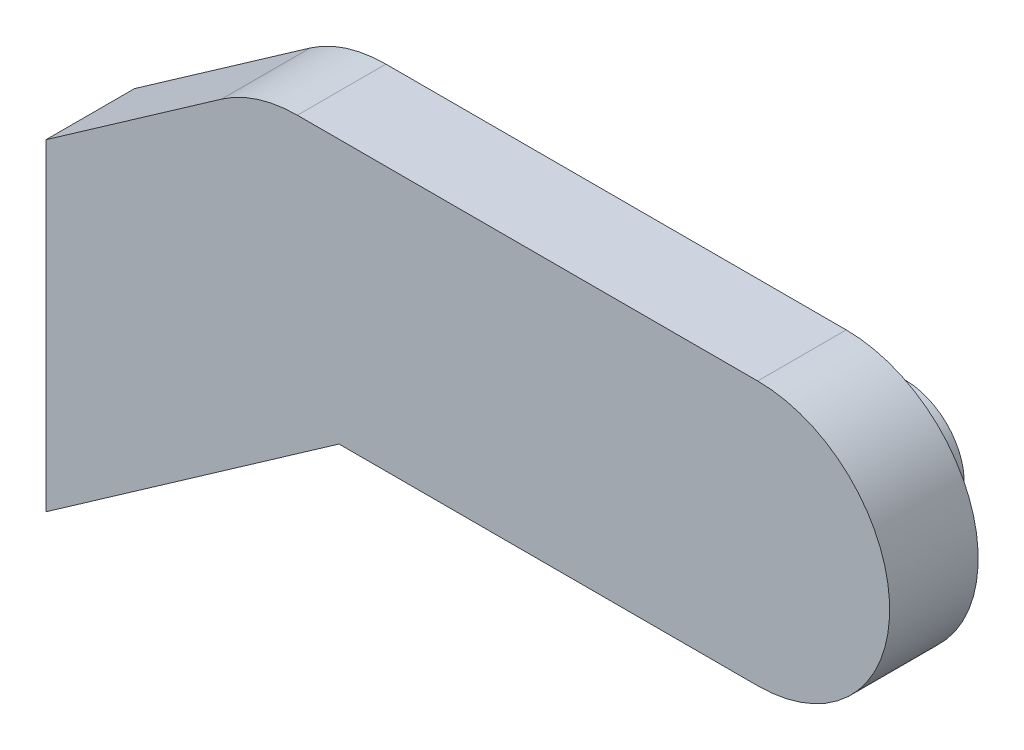
ISO-10303-21;
HEADER;
FILE_DESCRIPTION(('STEP AP214'),'2;1');
FILE_NAME('part.step','',(''),(''),'','','');
FILE_SCHEMA(('AUTOMOTIVE_DESIGN { 1 0 10303 214 1 1 1 1 }'));
ENDSEC;
DATA;
#1=APPLICATION_CONTEXT('core data for automotive mechanical design processes');
#2=APPLICATION_PROTOCOL_DEFINITION('international standard','automotive_design',2000,#1);
#3=PRODUCT_CONTEXT('',#1,'mechanical');
#4=PRODUCT('Part','Part','',(#3));
#5=PRODUCT_RELATED_PRODUCT_CATEGORY('part','',(#4));
#6=PRODUCT_DEFINITION_FORMATION('','',#4);
#7=PRODUCT_DEFINITION_CONTEXT('part definition',#1,'design');
#8=PRODUCT_DEFINITION('design','',#6,#7);
#9=PRODUCT_DEFINITION_SHAPE('','',#8);
#10=(LENGTH_UNIT() NAMED_UNIT(*) SI_UNIT(.MILLI.,.METRE.));
#11=(NAMED_UNIT(*) PLANE_ANGLE_UNIT() SI_UNIT($,.RADIAN.));
#12=(NAMED_UNIT(*) SI_UNIT($,.STERADIAN.) SOLID_ANGLE_UNIT());
#13=UNCERTAINTY_MEASURE_WITH_UNIT(LENGTH_MEASURE(1.E-05),#10,'distance_accuracy_value','');
#14=(GEOMETRIC_REPRESENTATION_CONTEXT(3) GLOBAL_UNCERTAINTY_ASSIGNED_CONTEXT((#13)) GLOBAL_UNIT_ASSIGNED_CONTEXT((#10,
#11,#12)) REPRESENTATION_CONTEXT('',''));
#15=CARTESIAN_POINT('',(0.,0.,0.));
#16=DIRECTION('',(0.,0.,1.));
#17=DIRECTION('',(1.,0.,0.));
#18=AXIS2_PLACEMENT_3D('',#15,#16,#17);
#19=CARTESIAN_POINT('',(0.,44.73,15.));
#20=DIRECTION('',(0.,-1.,0.));
#21=DIRECTION('',(0.,0.,-1.));
#22=AXIS2_PLACEMENT_3D('',#19,#20,#21);
#23=PLANE('',#22);
#24=DIRECTION('',(-1.,0.,0.));
#25=VECTOR('',#24,1.);
#26=CARTESIAN_POINT('',(0.,44.73,0.));
#27=LINE('',#26,#25);
#28=CARTESIAN_POINT('',(153.21162338788,44.73,0.));
#29=VERTEX_POINT('',#28);
#30=CARTESIAN_POINT('',(75.2116233878799,44.73,0.));
#31=VERTEX_POINT('',#30);
#32=EDGE_CURVE('E51',#29,#31,#27,.T.);
#33=ORIENTED_EDGE('',*,*,#32,.T.);
#34=DIRECTION('',(0.,0.,-1.));
#35=VECTOR('',#34,1.);
#36=CARTESIAN_POINT('',(75.2116233878799,44.73,102.507492208612));
#37=LINE('',#36,#35);
#38=CARTESIAN_POINT('',(75.2116233878799,44.73,15.));
#39=VERTEX_POINT('',#38);
#40=EDGE_CURVE('E109',#39,#31,#37,.T.);
#41=ORIENTED_EDGE('',*,*,#40,.F.);
#42=DIRECTION('',(-1.,0.,0.));
#43=VECTOR('',#42,1.);
#44=CARTESIAN_POINT('',(0.,44.73,15.));
#45=LINE('',#44,#43);
#46=CARTESIAN_POINT('',(153.21162338788,44.73,15.));
#47=VERTEX_POINT('',#46);
#48=EDGE_CURVE('E11',#47,#39,#45,.T.);
#49=ORIENTED_EDGE('',*,*,#48,.F.);
#50=DIRECTION('',(0.,0.,1.));
#51=VECTOR('',#50,1.);
#52=CARTESIAN_POINT('',(153.21162338788,44.73,-0.000999999999999265));
#53=LINE('',#52,#51);
#54=EDGE_CURVE('E131',#29,#47,#53,.T.);
#55=ORIENTED_EDGE('',*,*,#54,.F.);
#56=EDGE_LOOP('',(#33,#41,#49,#55));
#57=FACE_BOUND('',#56,.T.);
#58=ADVANCED_FACE('F50',(#57),#23,.F.);
#59=CARTESIAN_POINT('',(0.,0.,15.));
#60=DIRECTION('',(0.,0.,-1.));
#61=DIRECTION('',(-1.,0.,0.));
#62=AXIS2_PLACEMENT_3D('',#59,#60,#61);
#63=PLANE('',#62);
#64=DIRECTION('',(0.819152044288991,0.573576436351047,0.));
#65=VECTOR('',#64,1.);
#66=CARTESIAN_POINT('',(62.3835863888887,40.6853354705233,15.));
#67=LINE('',#66,#65);
#68=CARTESIAN_POINT('',(32.6157170848523,19.8416489873955,15.));
#69=VERTEX_POINT('',#68);
#70=CARTESIAN_POINT('',(62.3835863888887,40.6853354705233,15.));
#71=VERTEX_POINT('',#70);
#72=EDGE_CURVE('E184',#69,#71,#67,.T.);
#73=ORIENTED_EDGE('',*,*,#72,.F.);
#74=DIRECTION('',(0.,1.,0.));
#75=VECTOR('',#74,1.);
#76=CARTESIAN_POINT('',(32.6157170848524,0.,15.));
#77=LINE('',#76,#75);
#78=CARTESIAN_POINT('',(32.6157170848524,-34.7635983679045,15.));
#79=VERTEX_POINT('',#78);
#80=EDGE_CURVE('E174',#79,#69,#77,.T.);
#81=ORIENTED_EDGE('',*,*,#80,.F.);
#82=DIRECTION('',(0.819152044288991,0.573576436351047,0.));
#83=VECTOR('',#82,1.);
#84=CARTESIAN_POINT('',(27.0637908555533,-38.6510989652439,15.));
#85=LINE('',#84,#83);
#86=CARTESIAN_POINT('',(82.2632808011584,0.,15.));
#87=VERTEX_POINT('',#86);
#88=EDGE_CURVE('E153',#79,#87,#85,.T.);
#89=ORIENTED_EDGE('',*,*,#88,.T.);
#90=DIRECTION('',(1.,0.,0.));
#91=VECTOR('',#90,1.);
#92=CARTESIAN_POINT('',(0.,0.,15.));
#93=LINE('',#92,#91);
#94=CARTESIAN_POINT('',(153.21162338788,0.,15.));
#95=VERTEX_POINT('',#94);
#96=EDGE_CURVE('E57',#87,#95,#93,.T.);
#97=ORIENTED_EDGE('',*,*,#96,.T.);
#98=CARTESIAN_POINT('',(153.21162338788,22.365,15.));
#99=DIRECTION('',(0.,0.,1.));
#100=DIRECTION('',(1.,0.,0.));
#101=AXIS2_PLACEMENT_3D('',#98,#99,#100);
#102=CIRCLE('',#101,22.365);
#103=EDGE_CURVE('E136',#95,#47,#102,.T.);
#104=ORIENTED_EDGE('',*,*,#103,.T.);
#105=ORIENTED_EDGE('',*,*,#48,.T.);
#106=CARTESIAN_POINT('',(75.2116233878799,22.365,15.));
#107=DIRECTION('',(0.,0.,-1.));
#108=DIRECTION('',(-1.,0.,0.));
#109=AXIS2_PLACEMENT_3D('',#106,#107,#108);
#110=CIRCLE('',#109,22.365);
#111=EDGE_CURVE('E120',#71,#39,#110,.T.);
#112=ORIENTED_EDGE('',*,*,#111,.F.);
#113=EDGE_LOOP('',(#73,#81,#89,#97,#104,#105,#112));
#114=FACE_BOUND('',#113,.T.);
#115=ADVANCED_FACE('F200',(#114),#63,.F.);
#116=CARTESIAN_POINT('',(0.,0.,0.));
#117=DIRECTION('',(0.,0.,-1.));
#118=DIRECTION('',(-1.,0.,0.));
#119=AXIS2_PLACEMENT_3D('',#116,#117,#118);
#120=PLANE('',#119);
#121=DIRECTION('',(0.,-1.,0.));
#122=VECTOR('',#121,1.);
#123=CARTESIAN_POINT('',(32.6157170848524,0.,0.));
#124=LINE('',#123,#122);
#125=CARTESIAN_POINT('',(32.6157170848524,19.8416489873955,0.));
#126=VERTEX_POINT('',#125);
#127=CARTESIAN_POINT('',(32.6157170848524,-34.7635983679045,0.));
#128=VERTEX_POINT('',#127);
#129=EDGE_CURVE('E182',#126,#128,#124,.T.);
#130=ORIENTED_EDGE('',*,*,#129,.F.);
#131=DIRECTION('',(-0.819152044288991,-0.573576436351047,0.));
#132=VECTOR('',#131,1.);
#133=CARTESIAN_POINT('',(62.3835863888887,40.6853354705233,0.));
#134=LINE('',#133,#132);
#135=CARTESIAN_POINT('',(62.3835863888887,40.6853354705233,0.));
#136=VERTEX_POINT('',#135);
#137=EDGE_CURVE('E125',#136,#126,#134,.T.);
#138=ORIENTED_EDGE('',*,*,#137,.F.);
#139=CARTESIAN_POINT('',(75.2116233878799,22.365,0.));
#140=DIRECTION('',(0.,0.,1.));
#141=DIRECTION('',(-1.,0.,0.));
#142=AXIS2_PLACEMENT_3D('',#139,#140,#141);
#143=CIRCLE('',#142,22.365);
#144=EDGE_CURVE('E112',#31,#136,#143,.T.);
#145=ORIENTED_EDGE('',*,*,#144,.F.);
#146=ORIENTED_EDGE('',*,*,#32,.F.);
#147=CARTESIAN_POINT('',(153.21162338788,22.365,0.));
#148=DIRECTION('',(0.,0.,-1.));
#149=DIRECTION('',(-1.,0.,0.));
#150=AXIS2_PLACEMENT_3D('',#147,#148,#149);
#151=CIRCLE('',#150,22.365);
#152=CARTESIAN_POINT('',(153.21162338788,0.,0.));
#153=VERTEX_POINT('',#152);
#154=EDGE_CURVE('E142',#153,#29,#151,.F.);
#155=ORIENTED_EDGE('',*,*,#154,.F.);
#156=DIRECTION('',(1.,0.,0.));
#157=VECTOR('',#156,1.);
#158=CARTESIAN_POINT('',(0.,0.,0.));
#159=LINE('',#158,#157);
#160=CARTESIAN_POINT('',(82.2632808011584,0.,0.));
#161=VERTEX_POINT('',#160);
#162=EDGE_CURVE('E74',#161,#153,#159,.T.);
#163=ORIENTED_EDGE('',*,*,#162,.F.);
#164=DIRECTION('',(-0.819152044288991,-0.573576436351047,0.));
#165=VECTOR('',#164,1.);
#166=CARTESIAN_POINT('',(27.0637908555533,-38.6510989652439,0.));
#167=LINE('',#166,#165);
#168=EDGE_CURVE('E179',#161,#128,#167,.T.);
#169=ORIENTED_EDGE('',*,*,#168,.T.);
#170=EDGE_LOOP('',(#130,#138,#145,#146,#155,#163,#169));
#171=FACE_BOUND('',#170,.T.);
#172=CARTESIAN_POINT('',(153.21162338788,22.365,0.));
#173=DIRECTION('',(0.,0.,-1.));
#174=DIRECTION('',(-1.,0.,0.));
#175=AXIS2_PLACEMENT_3D('',#172,#173,#174);
#176=CIRCLE('',#175,10.);
#177=CARTESIAN_POINT('',(143.21162338788,22.365,0.));
#178=VERTEX_POINT('',#177);
#179=EDGE_CURVE('E144',#178,#178,#176,.T.);
#180=ORIENTED_EDGE('',*,*,#179,.F.);
#181=EDGE_LOOP('',(#180));
#182=FACE_BOUND('',#181,.T.);
#183=ADVANCED_FACE('F126',(#171,#182),#120,.T.);
#184=CARTESIAN_POINT('',(0.,0.,15.));
#185=DIRECTION('',(0.,1.,0.));
#186=DIRECTION('',(0.,0.,1.));
#187=AXIS2_PLACEMENT_3D('',#184,#185,#186);
#188=PLANE('',#187);
#189=ORIENTED_EDGE('',*,*,#96,.F.);
#190=DIRECTION('',(0.,0.,-1.));
#191=VECTOR('',#190,1.);
#192=CARTESIAN_POINT('',(82.2632808011584,0.,178.575832299459));
#193=LINE('',#192,#191);
#194=EDGE_CURVE('E63',#87,#161,#193,.T.);
#195=ORIENTED_EDGE('',*,*,#194,.T.);
#196=ORIENTED_EDGE('',*,*,#162,.T.);
#197=DIRECTION('',(0.,0.,1.));
#198=VECTOR('',#197,1.);
#199=CARTESIAN_POINT('',(153.21162338788,0.,-0.000999999999999265));
#200=LINE('',#199,#198);
#201=EDGE_CURVE('E133',#153,#95,#200,.T.);
#202=ORIENTED_EDGE('',*,*,#201,.T.);
#203=EDGE_LOOP('',(#189,#195,#196,#202));
#204=FACE_BOUND('',#203,.T.);
#205=ADVANCED_FACE('F47',(#204),#188,.F.);
#206=CARTESIAN_POINT('',(153.21162338788,22.365,-0.000999999999999265));
#207=DIRECTION('',(0.,0.,1.));
#208=DIRECTION('',(1.,0.,0.));
#209=AXIS2_PLACEMENT_3D('',#206,#207,#208);
#210=CYLINDRICAL_SURFACE('',#209,22.365);
#211=ORIENTED_EDGE('',*,*,#154,.T.);
#212=ORIENTED_EDGE('',*,*,#54,.T.);
#213=ORIENTED_EDGE('',*,*,#103,.F.);
#214=ORIENTED_EDGE('',*,*,#201,.F.);
#215=EDGE_LOOP('',(#211,#212,#213,#214));
#216=FACE_BOUND('',#215,.T.);
#217=ADVANCED_FACE('F201',(#216),#210,.T.);
#218=CARTESIAN_POINT('',(153.21162338788,22.365,-10.));
#219=DIRECTION('',(0.,0.,1.));
#220=DIRECTION('',(1.,0.,0.));
#221=AXIS2_PLACEMENT_3D('',#218,#219,#220);
#222=CYLINDRICAL_SURFACE('',#221,10.);
#223=CARTESIAN_POINT('',(153.21162338788,22.365,-10.));
#224=DIRECTION('',(0.,0.,-1.));
#225=DIRECTION('',(-1.,0.,0.));
#226=AXIS2_PLACEMENT_3D('',#223,#224,#225);
#227=CIRCLE('',#226,10.);
#228=CARTESIAN_POINT('',(143.21162338788,22.365,-10.));
#229=VERTEX_POINT('',#228);
#230=EDGE_CURVE('E141',#229,#229,#227,.T.);
#231=ORIENTED_EDGE('',*,*,#230,.F.);
#232=EDGE_LOOP('',(#231));
#233=FACE_BOUND('',#232,.T.);
#234=ORIENTED_EDGE('',*,*,#179,.T.);
#235=EDGE_LOOP('',(#234));
#236=FACE_BOUND('',#235,.T.);
#237=ADVANCED_FACE('F230',(#233,#236),#222,.T.);
#238=CARTESIAN_POINT('',(0.,0.,-10.));
#239=DIRECTION('',(0.,0.,-1.));
#240=DIRECTION('',(-1.,0.,0.));
#241=AXIS2_PLACEMENT_3D('',#238,#239,#240);
#242=PLANE('',#241);
#243=CARTESIAN_POINT('',(153.21162338788,29.365,-10.));
#244=DIRECTION('',(0.,0.,-1.));
#245=DIRECTION('',(-1.,0.,0.));
#246=AXIS2_PLACEMENT_3D('',#243,#244,#245);
#247=CIRCLE('',#246,0.999999999999998);
#248=CARTESIAN_POINT('',(152.21162338788,29.365,-10.));
#249=VERTEX_POINT('',#248);
#250=EDGE_CURVE('E169',#249,#249,#247,.T.);
#251=ORIENTED_EDGE('',*,*,#250,.F.);
#252=EDGE_LOOP('',(#251));
#253=FACE_BOUND('',#252,.T.);
#254=CARTESIAN_POINT('',(146.21162338788,22.3650000000001,-10.));
#255=DIRECTION('',(0.,0.,-1.));
#256=DIRECTION('',(-1.,0.,0.));
#257=AXIS2_PLACEMENT_3D('',#254,#255,#256);
#258=CIRCLE('',#257,0.999999999999998);
#259=CARTESIAN_POINT('',(145.21162338788,22.3650000000001,-10.));
#260=VERTEX_POINT('',#259);
#261=EDGE_CURVE('E168',#260,#260,#258,.T.);
#262=ORIENTED_EDGE('',*,*,#261,.F.);
#263=EDGE_LOOP('',(#262));
#264=FACE_BOUND('',#263,.T.);
#265=CARTESIAN_POINT('',(153.21162338788,15.365,-10.));
#266=DIRECTION('',(0.,0.,-1.));
#267=DIRECTION('',(-1.,0.,0.));
#268=AXIS2_PLACEMENT_3D('',#265,#266,#267);
#269=CIRCLE('',#268,0.999999999999996);
#270=CARTESIAN_POINT('',(152.21162338788,15.365,-10.));
#271=VERTEX_POINT('',#270);
#272=EDGE_CURVE('E157',#271,#271,#269,.T.);
#273=ORIENTED_EDGE('',*,*,#272,.F.);
#274=EDGE_LOOP('',(#273));
#275=FACE_BOUND('',#274,.T.);
#276=CARTESIAN_POINT('',(160.21162338788,22.365,-10.));
#277=DIRECTION('',(0.,0.,-1.));
#278=DIRECTION('',(-1.,0.,0.));
#279=AXIS2_PLACEMENT_3D('',#276,#277,#278);
#280=CIRCLE('',#279,0.99999999999999);
#281=CARTESIAN_POINT('',(159.21162338788,22.365,-10.));
#282=VERTEX_POINT('',#281);
#283=EDGE_CURVE('E155',#282,#282,#280,.T.);
#284=ORIENTED_EDGE('',*,*,#283,.F.);
#285=EDGE_LOOP('',(#284));
#286=FACE_BOUND('',#285,.T.);
#287=ORIENTED_EDGE('',*,*,#230,.T.);
#288=EDGE_LOOP('',(#287));
#289=FACE_BOUND('',#288,.T.);
#290=ADVANCED_FACE('F235',(#253,#264,#275,#286,#289),#242,.T.);
#291=CARTESIAN_POINT('',(160.21162338788,22.365,-5.));
#292=DIRECTION('',(0.,0.,-1.));
#293=DIRECTION('',(-1.,0.,0.));
#294=AXIS2_PLACEMENT_3D('',#291,#292,#293);
#295=CYLINDRICAL_SURFACE('',#294,0.99999999999999);
#296=CARTESIAN_POINT('',(160.21162338788,22.365,-5.));
#297=DIRECTION('',(0.,0.,-1.));
#298=DIRECTION('',(-1.,0.,0.));
#299=AXIS2_PLACEMENT_3D('',#296,#297,#298);
#300=CIRCLE('',#299,0.99999999999999);
#301=CARTESIAN_POINT('',(159.21162338788,22.365,-5.));
#302=VERTEX_POINT('',#301);
#303=EDGE_CURVE('E150',#302,#302,#300,.T.);
#304=ORIENTED_EDGE('',*,*,#303,.F.);
#305=EDGE_LOOP('',(#304));
#306=FACE_BOUND('',#305,.T.);
#307=ORIENTED_EDGE('',*,*,#283,.T.);
#308=EDGE_LOOP('',(#307));
#309=FACE_BOUND('',#308,.T.);
#310=ADVANCED_FACE('F236',(#306,#309),#295,.F.);
#311=CARTESIAN_POINT('',(160.21162338788,22.365,-5.));
#312=DIRECTION('',(0.,0.,-1.));
#313=DIRECTION('',(-1.,0.,0.));
#314=AXIS2_PLACEMENT_3D('',#311,#312,#313);
#315=PLANE('',#314);
#316=ORIENTED_EDGE('',*,*,#303,.T.);
#317=EDGE_LOOP('',(#316));
#318=FACE_BOUND('',#317,.T.);
#319=ADVANCED_FACE('F238',(#318),#315,.T.);
#320=CARTESIAN_POINT('',(153.21162338788,15.365,-5.));
#321=DIRECTION('',(0.,0.,-1.));
#322=DIRECTION('',(-1.,0.,0.));
#323=AXIS2_PLACEMENT_3D('',#320,#321,#322);
#324=CYLINDRICAL_SURFACE('',#323,0.999999999999996);
#325=CARTESIAN_POINT('',(153.21162338788,15.365,-5.));
#326=DIRECTION('',(0.,0.,-1.));
#327=DIRECTION('',(-1.,0.,0.));
#328=AXIS2_PLACEMENT_3D('',#325,#326,#327);
#329=CIRCLE('',#328,0.999999999999996);
#330=CARTESIAN_POINT('',(152.21162338788,15.365,-5.));
#331=VERTEX_POINT('',#330);
#332=EDGE_CURVE('E156',#331,#331,#329,.T.);
#333=ORIENTED_EDGE('',*,*,#332,.F.);
#334=EDGE_LOOP('',(#333));
#335=FACE_BOUND('',#334,.T.);
#336=ORIENTED_EDGE('',*,*,#272,.T.);
#337=EDGE_LOOP('',(#336));
#338=FACE_BOUND('',#337,.T.);
#339=ADVANCED_FACE('F241',(#335,#338),#324,.F.);
#340=CARTESIAN_POINT('',(153.21162338788,15.365,-5.));
#341=DIRECTION('',(0.,0.,-1.));
#342=DIRECTION('',(-1.,0.,0.));
#343=AXIS2_PLACEMENT_3D('',#340,#341,#342);
#344=PLANE('',#343);
#345=ORIENTED_EDGE('',*,*,#332,.T.);
#346=EDGE_LOOP('',(#345));
#347=FACE_BOUND('',#346,.T.);
#348=ADVANCED_FACE('F246',(#347),#344,.T.);
#349=CARTESIAN_POINT('',(146.21162338788,22.3650000000001,-5.));
#350=DIRECTION('',(0.,0.,-1.));
#351=DIRECTION('',(-1.,0.,0.));
#352=AXIS2_PLACEMENT_3D('',#349,#350,#351);
#353=CYLINDRICAL_SURFACE('',#352,0.999999999999998);
#354=CARTESIAN_POINT('',(146.21162338788,22.3650000000001,-5.));
#355=DIRECTION('',(0.,0.,-1.));
#356=DIRECTION('',(-1.,0.,0.));
#357=AXIS2_PLACEMENT_3D('',#354,#355,#356);
#358=CIRCLE('',#357,0.999999999999998);
#359=CARTESIAN_POINT('',(145.21162338788,22.3650000000001,-5.));
#360=VERTEX_POINT('',#359);
#361=EDGE_CURVE('E161',#360,#360,#358,.T.);
#362=ORIENTED_EDGE('',*,*,#361,.F.);
#363=EDGE_LOOP('',(#362));
#364=FACE_BOUND('',#363,.T.);
#365=ORIENTED_EDGE('',*,*,#261,.T.);
#366=EDGE_LOOP('',(#365));
#367=FACE_BOUND('',#366,.T.);
#368=ADVANCED_FACE('F248',(#364,#367),#353,.F.);
#369=CARTESIAN_POINT('',(146.21162338788,22.3650000000001,-5.));
#370=DIRECTION('',(0.,0.,-1.));
#371=DIRECTION('',(-1.,0.,0.));
#372=AXIS2_PLACEMENT_3D('',#369,#370,#371);
#373=PLANE('',#372);
#374=ORIENTED_EDGE('',*,*,#361,.T.);
#375=EDGE_LOOP('',(#374));
#376=FACE_BOUND('',#375,.T.);
#377=ADVANCED_FACE('F251',(#376),#373,.T.);
#378=CARTESIAN_POINT('',(153.21162338788,29.365,-5.));
#379=DIRECTION('',(0.,0.,-1.));
#380=DIRECTION('',(-1.,0.,0.));
#381=AXIS2_PLACEMENT_3D('',#378,#379,#380);
#382=CYLINDRICAL_SURFACE('',#381,0.999999999999998);
#383=CARTESIAN_POINT('',(153.21162338788,29.365,-5.));
#384=DIRECTION('',(0.,0.,-1.));
#385=DIRECTION('',(-1.,0.,0.));
#386=AXIS2_PLACEMENT_3D('',#383,#384,#385);
#387=CIRCLE('',#386,0.999999999999998);
#388=CARTESIAN_POINT('',(152.21162338788,29.365,-5.));
#389=VERTEX_POINT('',#388);
#390=EDGE_CURVE('E147',#389,#389,#387,.T.);
#391=ORIENTED_EDGE('',*,*,#390,.F.);
#392=EDGE_LOOP('',(#391));
#393=FACE_BOUND('',#392,.T.);
#394=ORIENTED_EDGE('',*,*,#250,.T.);
#395=EDGE_LOOP('',(#394));
#396=FACE_BOUND('',#395,.T.);
#397=ADVANCED_FACE('F216',(#393,#396),#382,.F.);
#398=CARTESIAN_POINT('',(153.21162338788,29.365,-5.));
#399=DIRECTION('',(0.,0.,-1.));
#400=DIRECTION('',(-1.,0.,0.));
#401=AXIS2_PLACEMENT_3D('',#398,#399,#400);
#402=PLANE('',#401);
#403=ORIENTED_EDGE('',*,*,#390,.T.);
#404=EDGE_LOOP('',(#403));
#405=FACE_BOUND('',#404,.T.);
#406=ADVANCED_FACE('F206',(#405),#402,.T.);
#407=CARTESIAN_POINT('',(32.6157170848524,0.,178.575832299459));
#408=DIRECTION('',(1.,0.,0.));
#409=DIRECTION('',(0.,0.,-1.));
#410=AXIS2_PLACEMENT_3D('',#407,#408,#409);
#411=PLANE('',#410);
#412=ORIENTED_EDGE('',*,*,#80,.T.);
#413=DIRECTION('',(0.,0.,-1.));
#414=VECTOR('',#413,1.);
#415=CARTESIAN_POINT('',(32.6157170848524,19.8416489873955,102.507492208612));
#416=LINE('',#415,#414);
#417=EDGE_CURVE('E189',#69,#126,#416,.T.);
#418=ORIENTED_EDGE('',*,*,#417,.T.);
#419=ORIENTED_EDGE('',*,*,#129,.T.);
#420=DIRECTION('',(0.,0.,-1.));
#421=VECTOR('',#420,1.);
#422=CARTESIAN_POINT('',(32.6157170848524,-34.7635983679045,178.575832299459));
#423=LINE('',#422,#421);
#424=EDGE_CURVE('E176',#79,#128,#423,.T.);
#425=ORIENTED_EDGE('',*,*,#424,.F.);
#426=EDGE_LOOP('',(#412,#418,#419,#425));
#427=FACE_BOUND('',#426,.T.);
#428=ADVANCED_FACE('F207',(#427),#411,.F.);
#429=CARTESIAN_POINT('',(27.0637908555533,-38.6510989652439,178.575832299459));
#430=DIRECTION('',(0.573576436351047,-0.819152044288991,0.));
#431=DIRECTION('',(0.819152044288991,0.573576436351047,0.));
#432=AXIS2_PLACEMENT_3D('',#429,#430,#431);
#433=PLANE('',#432);
#434=ORIENTED_EDGE('',*,*,#88,.F.);
#435=ORIENTED_EDGE('',*,*,#424,.T.);
#436=ORIENTED_EDGE('',*,*,#168,.F.);
#437=ORIENTED_EDGE('',*,*,#194,.F.);
#438=EDGE_LOOP('',(#434,#435,#436,#437));
#439=FACE_BOUND('',#438,.T.);
#440=ADVANCED_FACE('F205',(#439),#433,.T.);
#441=CARTESIAN_POINT('',(62.3835863888887,40.6853354705233,102.507492208612));
#442=DIRECTION('',(0.573576436351047,-0.819152044288991,0.));
#443=DIRECTION('',(0.819152044288991,0.573576436351047,0.));
#444=AXIS2_PLACEMENT_3D('',#441,#442,#443);
#445=PLANE('',#444);
#446=ORIENTED_EDGE('',*,*,#72,.T.);
#447=DIRECTION('',(0.,0.,-1.));
#448=VECTOR('',#447,1.);
#449=CARTESIAN_POINT('',(62.3835863888887,40.6853354705233,102.507492208612));
#450=LINE('',#449,#448);
#451=EDGE_CURVE('E122',#71,#136,#450,.T.);
#452=ORIENTED_EDGE('',*,*,#451,.T.);
#453=ORIENTED_EDGE('',*,*,#137,.T.);
#454=ORIENTED_EDGE('',*,*,#417,.F.);
#455=EDGE_LOOP('',(#446,#452,#453,#454));
#456=FACE_BOUND('',#455,.T.);
#457=ADVANCED_FACE('F199',(#456),#445,.F.);
#458=CARTESIAN_POINT('',(75.2116233878799,22.365,102.507492208612));
#459=DIRECTION('',(0.,0.,-1.));
#460=DIRECTION('',(-1.,0.,0.));
#461=AXIS2_PLACEMENT_3D('',#458,#459,#460);
#462=CYLINDRICAL_SURFACE('',#461,22.365);
#463=ORIENTED_EDGE('',*,*,#111,.T.);
#464=ORIENTED_EDGE('',*,*,#40,.T.);
#465=ORIENTED_EDGE('',*,*,#144,.T.);
#466=ORIENTED_EDGE('',*,*,#451,.F.);
#467=EDGE_LOOP('',(#463,#464,#465,#466));
#468=FACE_BOUND('',#467,.T.);
#469=ADVANCED_FACE('F115',(#468),#462,.T.);
#470=CLOSED_SHELL('',(#58,#115,#183,#205,#217,#237,#290,#310,#319,#339,#348,#368,#377,#397,#406,
#428,#440,#457,#469));
#471=MANIFOLD_SOLID_BREP('B2',#470);
#472=ADVANCED_BREP_SHAPE_REPRESENTATION('',(#18,#471),#14);
#473=SHAPE_DEFINITION_REPRESENTATION(#9,#472);
ENDSEC;
END-ISO-10303-21;
